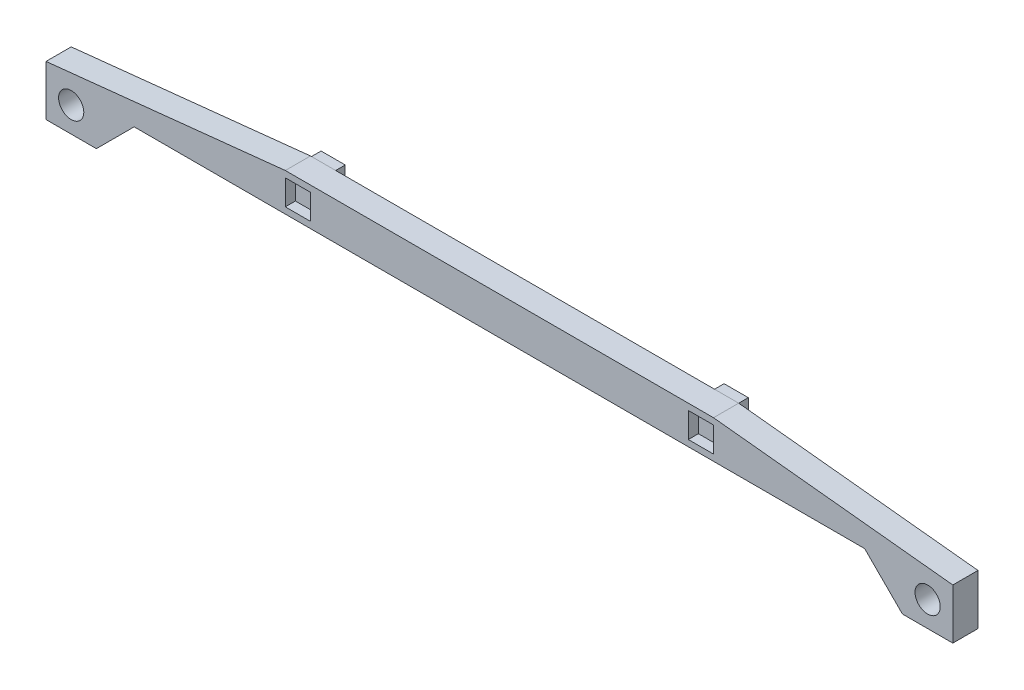
ISO-10303-21;
HEADER;
FILE_DESCRIPTION(('STEP AP214'),'2;1');
FILE_NAME('part.step','',(''),(''),'','','');
FILE_SCHEMA(('AUTOMOTIVE_DESIGN { 1 0 10303 214 1 1 1 1 }'));
ENDSEC;
DATA;
#1=APPLICATION_CONTEXT('core data for automotive mechanical design processes');
#2=APPLICATION_PROTOCOL_DEFINITION('international standard','automotive_design',2000,#1);
#3=PRODUCT_CONTEXT('',#1,'mechanical');
#4=PRODUCT('Part','Part','',(#3));
#5=PRODUCT_RELATED_PRODUCT_CATEGORY('part','',(#4));
#6=PRODUCT_DEFINITION_FORMATION('','',#4);
#7=PRODUCT_DEFINITION_CONTEXT('part definition',#1,'design');
#8=PRODUCT_DEFINITION('design','',#6,#7);
#9=PRODUCT_DEFINITION_SHAPE('','',#8);
#10=(LENGTH_UNIT() NAMED_UNIT(*) SI_UNIT(.MILLI.,.METRE.));
#11=(NAMED_UNIT(*) PLANE_ANGLE_UNIT() SI_UNIT($,.RADIAN.));
#12=(NAMED_UNIT(*) SI_UNIT($,.STERADIAN.) SOLID_ANGLE_UNIT());
#13=UNCERTAINTY_MEASURE_WITH_UNIT(LENGTH_MEASURE(1.E-05),#10,'distance_accuracy_value','');
#14=(GEOMETRIC_REPRESENTATION_CONTEXT(3) GLOBAL_UNCERTAINTY_ASSIGNED_CONTEXT((#13)) GLOBAL_UNIT_ASSIGNED_CONTEXT((#10,
#11,#12)) REPRESENTATION_CONTEXT('',''));
#15=CARTESIAN_POINT('',(0.,0.,0.));
#16=DIRECTION('',(0.,0.,1.));
#17=DIRECTION('',(1.,0.,0.));
#18=AXIS2_PLACEMENT_3D('',#15,#16,#17);
#19=CARTESIAN_POINT('',(-90.0000000000001,-5.,2.5));
#20=DIRECTION('',(0.,1.,0.));
#21=DIRECTION('',(0.,0.,1.));
#22=AXIS2_PLACEMENT_3D('',#19,#20,#21);
#23=PLANE('',#22);
#24=DIRECTION('',(1.,0.,0.));
#25=VECTOR('',#24,1.);
#26=CARTESIAN_POINT('',(-90.0000000000001,-5.,-2.5));
#27=LINE('',#26,#25);
#28=CARTESIAN_POINT('',(-90.0000000000001,-5.,-2.5));
#29=VERTEX_POINT('',#28);
#30=CARTESIAN_POINT('',(-80.,-5.,-2.5));
#31=VERTEX_POINT('',#30);
#32=EDGE_CURVE('E431',#29,#31,#27,.T.);
#33=ORIENTED_EDGE('',*,*,#32,.T.);
#34=DIRECTION('',(0.,0.,1.));
#35=VECTOR('',#34,1.);
#36=CARTESIAN_POINT('',(-80.,-5.,2.5));
#37=LINE('',#36,#35);
#38=CARTESIAN_POINT('',(-80.,-5.,2.5));
#39=VERTEX_POINT('',#38);
#40=EDGE_CURVE('E79',#31,#39,#37,.T.);
#41=ORIENTED_EDGE('',*,*,#40,.T.);
#42=DIRECTION('',(1.,0.,0.));
#43=VECTOR('',#42,1.);
#44=CARTESIAN_POINT('',(-90.0000000000001,-5.,2.5));
#45=LINE('',#44,#43);
#46=CARTESIAN_POINT('',(-90.0000000000001,-5.,2.5));
#47=VERTEX_POINT('',#46);
#48=EDGE_CURVE('E434',#47,#39,#45,.T.);
#49=ORIENTED_EDGE('',*,*,#48,.F.);
#50=DIRECTION('',(0.,0.,-1.));
#51=VECTOR('',#50,1.);
#52=CARTESIAN_POINT('',(-90.0000000000001,-5.,2.5));
#53=LINE('',#52,#51);
#54=EDGE_CURVE('E446',#47,#29,#53,.T.);
#55=ORIENTED_EDGE('',*,*,#54,.T.);
#56=EDGE_LOOP('',(#33,#41,#49,#55));
#57=FACE_BOUND('',#56,.T.);
#58=ADVANCED_FACE('F71',(#57),#23,.F.);
#59=CARTESIAN_POINT('',(-42.5,10.,-4.5));
#60=DIRECTION('',(0.,-1.,0.));
#61=DIRECTION('',(0.,0.,-1.));
#62=AXIS2_PLACEMENT_3D('',#59,#60,#61);
#63=PLANE('',#62);
#64=DIRECTION('',(-1.,0.,0.));
#65=VECTOR('',#64,1.);
#66=CARTESIAN_POINT('',(0.,10.,-2.5));
#67=LINE('',#66,#65);
#68=CARTESIAN_POINT('',(42.5,10.,-2.5));
#69=VERTEX_POINT('',#68);
#70=CARTESIAN_POINT('',(-42.5,10.,-2.5));
#71=VERTEX_POINT('',#70);
#72=EDGE_CURVE('E352',#69,#71,#67,.T.);
#73=ORIENTED_EDGE('',*,*,#72,.T.);
#74=DIRECTION('',(0.,0.,1.));
#75=VECTOR('',#74,1.);
#76=CARTESIAN_POINT('',(-42.5,10.,-4.5));
#77=LINE('',#76,#75);
#78=CARTESIAN_POINT('',(-42.5,10.,2.5));
#79=VERTEX_POINT('',#78);
#80=EDGE_CURVE('E376',#71,#79,#77,.T.);
#81=ORIENTED_EDGE('',*,*,#80,.T.);
#82=DIRECTION('',(1.,0.,0.));
#83=VECTOR('',#82,1.);
#84=CARTESIAN_POINT('',(0.,10.,2.5));
#85=LINE('',#84,#83);
#86=CARTESIAN_POINT('',(42.5,10.,2.5));
#87=VERTEX_POINT('',#86);
#88=EDGE_CURVE('E410',#79,#87,#85,.T.);
#89=ORIENTED_EDGE('',*,*,#88,.T.);
#90=DIRECTION('',(0.,0.,1.));
#91=VECTOR('',#90,1.);
#92=CARTESIAN_POINT('',(42.5,10.,-4.5));
#93=LINE('',#92,#91);
#94=EDGE_CURVE('E412',#69,#87,#93,.T.);
#95=ORIENTED_EDGE('',*,*,#94,.F.);
#96=EDGE_LOOP('',(#73,#81,#89,#95));
#97=FACE_BOUND('',#96,.T.);
#98=ADVANCED_FACE('F501',(#97),#63,.F.);
#99=CARTESIAN_POINT('',(0.,0.,2.5));
#100=DIRECTION('',(0.,0.,-1.));
#101=DIRECTION('',(-1.,0.,0.));
#102=AXIS2_PLACEMENT_3D('',#99,#100,#101);
#103=PLANE('',#102);
#104=DIRECTION('',(-1.,0.,0.));
#105=VECTOR('',#104,1.);
#106=CARTESIAN_POINT('',(-42.5,8.75000000000001,2.5));
#107=LINE('',#106,#105);
#108=CARTESIAN_POINT('',(-37.5,8.75000000000001,2.5));
#109=VERTEX_POINT('',#108);
#110=CARTESIAN_POINT('',(-42.5,8.75000000000001,2.5));
#111=VERTEX_POINT('',#110);
#112=EDGE_CURVE('E272',#109,#111,#107,.T.);
#113=ORIENTED_EDGE('',*,*,#112,.F.);
#114=DIRECTION('',(0.,1.,0.));
#115=VECTOR('',#114,1.);
#116=CARTESIAN_POINT('',(-37.5,3.75000000000001,2.5));
#117=LINE('',#116,#115);
#118=CARTESIAN_POINT('',(-37.5,3.75000000000001,2.5));
#119=VERTEX_POINT('',#118);
#120=EDGE_CURVE('E86',#119,#109,#117,.T.);
#121=ORIENTED_EDGE('',*,*,#120,.F.);
#122=DIRECTION('',(1.,0.,0.));
#123=VECTOR('',#122,1.);
#124=CARTESIAN_POINT('',(-42.5,3.75000000000001,2.5));
#125=LINE('',#124,#123);
#126=CARTESIAN_POINT('',(-42.5,3.75000000000001,2.5));
#127=VERTEX_POINT('',#126);
#128=EDGE_CURVE('E263',#127,#119,#125,.T.);
#129=ORIENTED_EDGE('',*,*,#128,.F.);
#130=DIRECTION('',(0.,-1.,0.));
#131=VECTOR('',#130,1.);
#132=CARTESIAN_POINT('',(-42.5,3.75000000000001,2.5));
#133=LINE('',#132,#131);
#134=EDGE_CURVE('E266',#111,#127,#133,.T.);
#135=ORIENTED_EDGE('',*,*,#134,.F.);
#136=EDGE_LOOP('',(#113,#121,#129,#135));
#137=FACE_BOUND('',#136,.T.);
#138=DIRECTION('',(-1.,0.,0.));
#139=VECTOR('',#138,1.);
#140=CARTESIAN_POINT('',(37.5,8.75000000000001,2.5));
#141=LINE('',#140,#139);
#142=CARTESIAN_POINT('',(42.5,8.75000000000001,2.5));
#143=VERTEX_POINT('',#142);
#144=CARTESIAN_POINT('',(37.5,8.75000000000001,2.5));
#145=VERTEX_POINT('',#144);
#146=EDGE_CURVE('E298',#143,#145,#141,.T.);
#147=ORIENTED_EDGE('',*,*,#146,.F.);
#148=DIRECTION('',(0.,1.,0.));
#149=VECTOR('',#148,1.);
#150=CARTESIAN_POINT('',(42.5,3.75000000000001,2.5));
#151=LINE('',#150,#149);
#152=CARTESIAN_POINT('',(42.5,3.75000000000001,2.5));
#153=VERTEX_POINT('',#152);
#154=EDGE_CURVE('E94',#153,#143,#151,.T.);
#155=ORIENTED_EDGE('',*,*,#154,.F.);
#156=DIRECTION('',(1.,0.,0.));
#157=VECTOR('',#156,1.);
#158=CARTESIAN_POINT('',(37.5,3.75000000000001,2.5));
#159=LINE('',#158,#157);
#160=CARTESIAN_POINT('',(37.5,3.75000000000001,2.5));
#161=VERTEX_POINT('',#160);
#162=EDGE_CURVE('E291',#161,#153,#159,.T.);
#163=ORIENTED_EDGE('',*,*,#162,.F.);
#164=DIRECTION('',(0.,-1.,0.));
#165=VECTOR('',#164,1.);
#166=CARTESIAN_POINT('',(37.5,3.75000000000001,2.5));
#167=LINE('',#166,#165);
#168=EDGE_CURVE('E294',#145,#161,#167,.T.);
#169=ORIENTED_EDGE('',*,*,#168,.F.);
#170=EDGE_LOOP('',(#147,#155,#163,#169));
#171=FACE_BOUND('',#170,.T.);
#172=ORIENTED_EDGE('',*,*,#88,.F.);
#173=DIRECTION('',(-0.994505452921406,-0.104684784518043,0.));
#174=VECTOR('',#173,1.);
#175=CARTESIAN_POINT('',(-42.5,10.,2.5));
#176=LINE('',#175,#174);
#177=CARTESIAN_POINT('',(-90.0000000000001,5.,2.5));
#178=VERTEX_POINT('',#177);
#179=EDGE_CURVE('E317',#79,#178,#176,.T.);
#180=ORIENTED_EDGE('',*,*,#179,.T.);
#181=DIRECTION('',(0.,-1.,0.));
#182=VECTOR('',#181,1.);
#183=CARTESIAN_POINT('',(-90.0000000000001,-5.,2.5));
#184=LINE('',#183,#182);
#185=EDGE_CURVE('E430',#178,#47,#184,.T.);
#186=ORIENTED_EDGE('',*,*,#185,.T.);
#187=ORIENTED_EDGE('',*,*,#48,.T.);
#188=DIRECTION('',(-0.707106781186545,-0.70710678118655,0.));
#189=VECTOR('',#188,1.);
#190=CARTESIAN_POINT('',(-80.,-5.,2.5));
#191=LINE('',#190,#189);
#192=CARTESIAN_POINT('',(-72.5000000000001,2.5,2.5));
#193=VERTEX_POINT('',#192);
#194=EDGE_CURVE('E328',#193,#39,#191,.T.);
#195=ORIENTED_EDGE('',*,*,#194,.F.);
#196=DIRECTION('',(-1.,0.,0.));
#197=VECTOR('',#196,1.);
#198=CARTESIAN_POINT('',(-72.5000000000001,2.5,2.5));
#199=LINE('',#198,#197);
#200=CARTESIAN_POINT('',(72.5000000000001,2.5,2.5));
#201=VERTEX_POINT('',#200);
#202=EDGE_CURVE('E325',#201,#193,#199,.T.);
#203=ORIENTED_EDGE('',*,*,#202,.F.);
#204=DIRECTION('',(-0.707106781186545,0.70710678118655,0.));
#205=VECTOR('',#204,1.);
#206=CARTESIAN_POINT('',(72.5000000000001,2.5,2.5));
#207=LINE('',#206,#205);
#208=CARTESIAN_POINT('',(80.,-5.,2.5));
#209=VERTEX_POINT('',#208);
#210=EDGE_CURVE('E322',#209,#201,#207,.T.);
#211=ORIENTED_EDGE('',*,*,#210,.F.);
#212=CARTESIAN_POINT('',(89.9999999999999,-5.,2.5));
#213=VERTEX_POINT('',#212);
#214=EDGE_CURVE('E433',#209,#213,#45,.T.);
#215=ORIENTED_EDGE('',*,*,#214,.T.);
#216=DIRECTION('',(0.,1.,0.));
#217=VECTOR('',#216,1.);
#218=CARTESIAN_POINT('',(89.9999999999999,-5.,2.5));
#219=LINE('',#218,#217);
#220=CARTESIAN_POINT('',(89.9999999999999,5.,2.5));
#221=VERTEX_POINT('',#220);
#222=EDGE_CURVE('E428',#213,#221,#219,.T.);
#223=ORIENTED_EDGE('',*,*,#222,.T.);
#224=DIRECTION('',(-0.994505452921406,0.104684784518043,0.));
#225=VECTOR('',#224,1.);
#226=CARTESIAN_POINT('',(89.9999999999999,5.,2.5));
#227=LINE('',#226,#225);
#228=EDGE_CURVE('E314',#221,#87,#227,.T.);
#229=ORIENTED_EDGE('',*,*,#228,.T.);
#230=EDGE_LOOP('',(#172,#180,#186,#187,#195,#203,#211,#215,#223,#229));
#231=FACE_BOUND('',#230,.T.);
#232=CARTESIAN_POINT('',(-85.,0.,2.5));
#233=DIRECTION('',(0.,0.,1.));
#234=DIRECTION('',(1.,0.,0.));
#235=AXIS2_PLACEMENT_3D('',#232,#233,#234);
#236=CIRCLE('',#235,2.49999999999999);
#237=CARTESIAN_POINT('',(-82.5,0.,2.5));
#238=VERTEX_POINT('',#237);
#239=EDGE_CURVE('E422',#238,#238,#236,.T.);
#240=ORIENTED_EDGE('',*,*,#239,.F.);
#241=EDGE_LOOP('',(#240));
#242=FACE_BOUND('',#241,.T.);
#243=CARTESIAN_POINT('',(85.,0.,2.5));
#244=DIRECTION('',(0.,0.,1.));
#245=DIRECTION('',(1.,0.,0.));
#246=AXIS2_PLACEMENT_3D('',#243,#244,#245);
#247=CIRCLE('',#246,2.49999999999999);
#248=CARTESIAN_POINT('',(87.5,0.,2.5));
#249=VERTEX_POINT('',#248);
#250=EDGE_CURVE('E416',#249,#249,#247,.T.);
#251=ORIENTED_EDGE('',*,*,#250,.F.);
#252=EDGE_LOOP('',(#251));
#253=FACE_BOUND('',#252,.T.);
#254=ADVANCED_FACE('F465',(#137,#171,#231,#242,#253),#103,.F.);
#255=CARTESIAN_POINT('',(0.,0.,-2.5));
#256=DIRECTION('',(0.,0.,-1.));
#257=DIRECTION('',(-1.,0.,0.));
#258=AXIS2_PLACEMENT_3D('',#255,#256,#257);
#259=PLANE('',#258);
#260=DIRECTION('',(0.,-1.,0.));
#261=VECTOR('',#260,1.);
#262=CARTESIAN_POINT('',(-90.0000000000001,-5.,-2.5));
#263=LINE('',#262,#261);
#264=CARTESIAN_POINT('',(-90.0000000000001,5.,-2.5));
#265=VERTEX_POINT('',#264);
#266=EDGE_CURVE('E439',#265,#29,#263,.T.);
#267=ORIENTED_EDGE('',*,*,#266,.F.);
#268=DIRECTION('',(-0.994505452921406,-0.104684784518043,0.));
#269=VECTOR('',#268,1.);
#270=CARTESIAN_POINT('',(-42.5,10.,-2.5));
#271=LINE('',#270,#269);
#272=EDGE_CURVE('E320',#71,#265,#271,.T.);
#273=ORIENTED_EDGE('',*,*,#272,.F.);
#274=ORIENTED_EDGE('',*,*,#72,.F.);
#275=DIRECTION('',(-0.994505452921406,0.104684784518043,0.));
#276=VECTOR('',#275,1.);
#277=CARTESIAN_POINT('',(89.9999999999999,5.,-2.5));
#278=LINE('',#277,#276);
#279=CARTESIAN_POINT('',(89.9999999999999,5.,-2.5));
#280=VERTEX_POINT('',#279);
#281=EDGE_CURVE('E278',#280,#69,#278,.T.);
#282=ORIENTED_EDGE('',*,*,#281,.F.);
#283=DIRECTION('',(0.,1.,0.));
#284=VECTOR('',#283,1.);
#285=CARTESIAN_POINT('',(89.9999999999999,-5.,-2.5));
#286=LINE('',#285,#284);
#287=CARTESIAN_POINT('',(89.9999999999999,-5.,-2.5));
#288=VERTEX_POINT('',#287);
#289=EDGE_CURVE('E425',#288,#280,#286,.T.);
#290=ORIENTED_EDGE('',*,*,#289,.F.);
#291=CARTESIAN_POINT('',(80.,-5.,-2.5));
#292=VERTEX_POINT('',#291);
#293=EDGE_CURVE('E441',#292,#288,#27,.T.);
#294=ORIENTED_EDGE('',*,*,#293,.F.);
#295=DIRECTION('',(0.707106781186545,-0.70710678118655,0.));
#296=VECTOR('',#295,1.);
#297=CARTESIAN_POINT('',(37.5000000000003,37.5,-2.5));
#298=LINE('',#297,#296);
#299=CARTESIAN_POINT('',(72.5000000000001,2.5,-2.5));
#300=VERTEX_POINT('',#299);
#301=EDGE_CURVE('E333',#300,#292,#298,.T.);
#302=ORIENTED_EDGE('',*,*,#301,.F.);
#303=DIRECTION('',(1.,0.,0.));
#304=VECTOR('',#303,1.);
#305=CARTESIAN_POINT('',(0.,2.5,-2.5));
#306=LINE('',#305,#304);
#307=CARTESIAN_POINT('',(-72.5000000000001,2.5,-2.5));
#308=VERTEX_POINT('',#307);
#309=EDGE_CURVE('E12',#308,#300,#306,.T.);
#310=ORIENTED_EDGE('',*,*,#309,.F.);
#311=DIRECTION('',(0.707106781186545,0.70710678118655,0.));
#312=VECTOR('',#311,1.);
#313=CARTESIAN_POINT('',(-37.5000000000003,37.5,-2.5));
#314=LINE('',#313,#312);
#315=EDGE_CURVE('E336',#31,#308,#314,.T.);
#316=ORIENTED_EDGE('',*,*,#315,.F.);
#317=ORIENTED_EDGE('',*,*,#32,.F.);
#318=EDGE_LOOP('',(#267,#273,#274,#282,#290,#294,#302,#310,#316,#317));
#319=FACE_BOUND('',#318,.T.);
#320=CARTESIAN_POINT('',(-85.,0.,-2.5));
#321=DIRECTION('',(0.,0.,1.));
#322=DIRECTION('',(1.,0.,0.));
#323=AXIS2_PLACEMENT_3D('',#320,#321,#322);
#324=CIRCLE('',#323,2.49999999999999);
#325=CARTESIAN_POINT('',(-82.5,0.,-2.5));
#326=VERTEX_POINT('',#325);
#327=EDGE_CURVE('E419',#326,#326,#324,.T.);
#328=ORIENTED_EDGE('',*,*,#327,.T.);
#329=EDGE_LOOP('',(#328));
#330=FACE_BOUND('',#329,.T.);
#331=CARTESIAN_POINT('',(85.,0.,-2.5));
#332=DIRECTION('',(0.,0.,1.));
#333=DIRECTION('',(1.,0.,0.));
#334=AXIS2_PLACEMENT_3D('',#331,#332,#333);
#335=CIRCLE('',#334,2.49999999999999);
#336=CARTESIAN_POINT('',(87.5,0.,-2.5));
#337=VERTEX_POINT('',#336);
#338=EDGE_CURVE('E415',#337,#337,#335,.T.);
#339=ORIENTED_EDGE('',*,*,#338,.T.);
#340=EDGE_LOOP('',(#339));
#341=FACE_BOUND('',#340,.T.);
#342=DIRECTION('',(-1.,0.,0.));
#343=VECTOR('',#342,1.);
#344=CARTESIAN_POINT('',(0.,9.9,-2.5));
#345=LINE('',#344,#343);
#346=CARTESIAN_POINT('',(-37.6,9.9,-2.5));
#347=VERTEX_POINT('',#346);
#348=CARTESIAN_POINT('',(-42.4,9.9,-2.5));
#349=VERTEX_POINT('',#348);
#350=EDGE_CURVE('E357',#347,#349,#345,.T.);
#351=ORIENTED_EDGE('',*,*,#350,.T.);
#352=DIRECTION('',(0.,-1.,0.));
#353=VECTOR('',#352,1.);
#354=CARTESIAN_POINT('',(-42.4,0.,-2.5));
#355=LINE('',#354,#353);
#356=CARTESIAN_POINT('',(-42.4,5.1,-2.5));
#357=VERTEX_POINT('',#356);
#358=EDGE_CURVE('E364',#349,#357,#355,.T.);
#359=ORIENTED_EDGE('',*,*,#358,.T.);
#360=DIRECTION('',(1.,0.,0.));
#361=VECTOR('',#360,1.);
#362=CARTESIAN_POINT('',(0.,5.1,-2.5));
#363=LINE('',#362,#361);
#364=CARTESIAN_POINT('',(-37.6,5.1,-2.5));
#365=VERTEX_POINT('',#364);
#366=EDGE_CURVE('E347',#357,#365,#363,.T.);
#367=ORIENTED_EDGE('',*,*,#366,.T.);
#368=DIRECTION('',(0.,1.,0.));
#369=VECTOR('',#368,1.);
#370=CARTESIAN_POINT('',(-37.6,0.,-2.5));
#371=LINE('',#370,#369);
#372=EDGE_CURVE('E342',#365,#347,#371,.T.);
#373=ORIENTED_EDGE('',*,*,#372,.T.);
#374=EDGE_LOOP('',(#351,#359,#367,#373));
#375=FACE_BOUND('',#374,.T.);
#376=DIRECTION('',(1.,0.,0.));
#377=VECTOR('',#376,1.);
#378=CARTESIAN_POINT('',(0.,5.1,-2.5));
#379=LINE('',#378,#377);
#380=CARTESIAN_POINT('',(37.6,5.1,-2.5));
#381=VERTEX_POINT('',#380);
#382=CARTESIAN_POINT('',(42.4,5.1,-2.5));
#383=VERTEX_POINT('',#382);
#384=EDGE_CURVE('E393',#381,#383,#379,.T.);
#385=ORIENTED_EDGE('',*,*,#384,.T.);
#386=DIRECTION('',(0.,1.,0.));
#387=VECTOR('',#386,1.);
#388=CARTESIAN_POINT('',(42.4,0.,-2.5));
#389=LINE('',#388,#387);
#390=CARTESIAN_POINT('',(42.4,9.89999999999998,-2.5));
#391=VERTEX_POINT('',#390);
#392=EDGE_CURVE('E338',#383,#391,#389,.T.);
#393=ORIENTED_EDGE('',*,*,#392,.T.);
#394=DIRECTION('',(-1.,0.,0.));
#395=VECTOR('',#394,1.);
#396=CARTESIAN_POINT('',(0.,9.89999999999998,-2.5));
#397=LINE('',#396,#395);
#398=CARTESIAN_POINT('',(37.6,9.89999999999998,-2.5));
#399=VERTEX_POINT('',#398);
#400=EDGE_CURVE('E385',#391,#399,#397,.T.);
#401=ORIENTED_EDGE('',*,*,#400,.T.);
#402=DIRECTION('',(0.,-1.,0.));
#403=VECTOR('',#402,1.);
#404=CARTESIAN_POINT('',(37.6,0.,-2.5));
#405=LINE('',#404,#403);
#406=EDGE_CURVE('E380',#399,#381,#405,.T.);
#407=ORIENTED_EDGE('',*,*,#406,.T.);
#408=EDGE_LOOP('',(#385,#393,#401,#407));
#409=FACE_BOUND('',#408,.T.);
#410=ADVANCED_FACE('F475',(#319,#330,#341,#375,#409),#259,.T.);
#411=CARTESIAN_POINT('',(89.9999999999999,-5.,2.5));
#412=DIRECTION('',(-1.,0.,0.));
#413=DIRECTION('',(0.,0.,1.));
#414=AXIS2_PLACEMENT_3D('',#411,#412,#413);
#415=PLANE('',#414);
#416=ORIENTED_EDGE('',*,*,#289,.T.);
#417=DIRECTION('',(0.,0.,-1.));
#418=VECTOR('',#417,1.);
#419=CARTESIAN_POINT('',(89.9999999999999,5.,2.5));
#420=LINE('',#419,#418);
#421=EDGE_CURVE('E452',#221,#280,#420,.T.);
#422=ORIENTED_EDGE('',*,*,#421,.F.);
#423=ORIENTED_EDGE('',*,*,#222,.F.);
#424=DIRECTION('',(0.,0.,-1.));
#425=VECTOR('',#424,1.);
#426=CARTESIAN_POINT('',(89.9999999999999,-5.,2.5));
#427=LINE('',#426,#425);
#428=EDGE_CURVE('E437',#213,#288,#427,.T.);
#429=ORIENTED_EDGE('',*,*,#428,.T.);
#430=EDGE_LOOP('',(#416,#422,#423,#429));
#431=FACE_BOUND('',#430,.T.);
#432=ADVANCED_FACE('F73',(#431),#415,.F.);
#433=CARTESIAN_POINT('',(-90.0000000000001,-5.,2.5));
#434=DIRECTION('',(1.,0.,0.));
#435=DIRECTION('',(0.,0.,-1.));
#436=AXIS2_PLACEMENT_3D('',#433,#434,#435);
#437=PLANE('',#436);
#438=ORIENTED_EDGE('',*,*,#266,.T.);
#439=ORIENTED_EDGE('',*,*,#54,.F.);
#440=ORIENTED_EDGE('',*,*,#185,.F.);
#441=DIRECTION('',(0.,0.,-1.));
#442=VECTOR('',#441,1.);
#443=CARTESIAN_POINT('',(-90.0000000000001,5.,2.5));
#444=LINE('',#443,#442);
#445=EDGE_CURVE('E449',#178,#265,#444,.T.);
#446=ORIENTED_EDGE('',*,*,#445,.T.);
#447=EDGE_LOOP('',(#438,#439,#440,#446));
#448=FACE_BOUND('',#447,.T.);
#449=ADVANCED_FACE('F472',(#448),#437,.F.);
#450=ORIENTED_EDGE('',*,*,#214,.F.);
#451=DIRECTION('',(0.,0.,-1.));
#452=VECTOR('',#451,1.);
#453=CARTESIAN_POINT('',(80.,-5.,2.5));
#454=LINE('',#453,#452);
#455=EDGE_CURVE('E455',#209,#292,#454,.T.);
#456=ORIENTED_EDGE('',*,*,#455,.T.);
#457=ORIENTED_EDGE('',*,*,#293,.T.);
#458=ORIENTED_EDGE('',*,*,#428,.F.);
#459=EDGE_LOOP('',(#450,#456,#457,#458));
#460=FACE_BOUND('',#459,.T.);
#461=ADVANCED_FACE('F489',(#460),#23,.F.);
#462=CARTESIAN_POINT('',(-85.,0.,2.5));
#463=DIRECTION('',(0.,0.,-1.));
#464=DIRECTION('',(-1.,0.,0.));
#465=AXIS2_PLACEMENT_3D('',#462,#463,#464);
#466=CYLINDRICAL_SURFACE('',#465,2.49999999999999);
#467=ORIENTED_EDGE('',*,*,#239,.T.);
#468=EDGE_LOOP('',(#467));
#469=FACE_BOUND('',#468,.T.);
#470=ORIENTED_EDGE('',*,*,#327,.F.);
#471=EDGE_LOOP('',(#470));
#472=FACE_BOUND('',#471,.T.);
#473=ADVANCED_FACE('F525',(#469,#472),#466,.F.);
#474=CARTESIAN_POINT('',(85.,0.,2.5));
#475=DIRECTION('',(0.,0.,-1.));
#476=DIRECTION('',(-1.,0.,0.));
#477=AXIS2_PLACEMENT_3D('',#474,#475,#476);
#478=CYLINDRICAL_SURFACE('',#477,2.49999999999999);
#479=ORIENTED_EDGE('',*,*,#250,.T.);
#480=EDGE_LOOP('',(#479));
#481=FACE_BOUND('',#480,.T.);
#482=ORIENTED_EDGE('',*,*,#338,.F.);
#483=EDGE_LOOP('',(#482));
#484=FACE_BOUND('',#483,.T.);
#485=ADVANCED_FACE('F530',(#481,#484),#478,.F.);
#486=CARTESIAN_POINT('',(-42.4,0.,4.57106781186548));
#487=DIRECTION('',(-1.,0.,0.));
#488=DIRECTION('',(0.,0.,1.));
#489=AXIS2_PLACEMENT_3D('',#486,#487,#488);
#490=PLANE('',#489);
#491=DIRECTION('',(0.,0.,-1.));
#492=VECTOR('',#491,1.);
#493=CARTESIAN_POINT('',(-42.4,9.9,4.57106781186548));
#494=LINE('',#493,#492);
#495=CARTESIAN_POINT('',(-42.4,9.9,-4.5));
#496=VERTEX_POINT('',#495);
#497=EDGE_CURVE('E343',#349,#496,#494,.T.);
#498=ORIENTED_EDGE('',*,*,#497,.T.);
#499=DIRECTION('',(0.,1.,0.));
#500=VECTOR('',#499,1.);
#501=CARTESIAN_POINT('',(-42.4,0.,-4.5));
#502=LINE('',#501,#500);
#503=CARTESIAN_POINT('',(-42.4,5.1,-4.5));
#504=VERTEX_POINT('',#503);
#505=EDGE_CURVE('E354',#504,#496,#502,.T.);
#506=ORIENTED_EDGE('',*,*,#505,.F.);
#507=DIRECTION('',(0.,0.,-1.));
#508=VECTOR('',#507,1.);
#509=CARTESIAN_POINT('',(-42.4,5.1,4.57106781186548));
#510=LINE('',#509,#508);
#511=EDGE_CURVE('E358',#357,#504,#510,.T.);
#512=ORIENTED_EDGE('',*,*,#511,.F.);
#513=ORIENTED_EDGE('',*,*,#358,.F.);
#514=EDGE_LOOP('',(#498,#506,#512,#513));
#515=FACE_BOUND('',#514,.T.);
#516=ADVANCED_FACE('F547',(#515),#490,.T.);
#517=CARTESIAN_POINT('',(0.,9.9,4.57106781186548));
#518=DIRECTION('',(0.,1.,0.));
#519=DIRECTION('',(0.,0.,1.));
#520=AXIS2_PLACEMENT_3D('',#517,#518,#519);
#521=PLANE('',#520);
#522=DIRECTION('',(0.,0.,-1.));
#523=VECTOR('',#522,1.);
#524=CARTESIAN_POINT('',(-37.6,9.9,4.57106781186548));
#525=LINE('',#524,#523);
#526=CARTESIAN_POINT('',(-37.6,9.9,-4.5));
#527=VERTEX_POINT('',#526);
#528=EDGE_CURVE('E348',#347,#527,#525,.T.);
#529=ORIENTED_EDGE('',*,*,#528,.T.);
#530=DIRECTION('',(1.,0.,0.));
#531=VECTOR('',#530,1.);
#532=CARTESIAN_POINT('',(0.,9.9,-4.5));
#533=LINE('',#532,#531);
#534=EDGE_CURVE('E339',#496,#527,#533,.T.);
#535=ORIENTED_EDGE('',*,*,#534,.F.);
#536=ORIENTED_EDGE('',*,*,#497,.F.);
#537=ORIENTED_EDGE('',*,*,#350,.F.);
#538=EDGE_LOOP('',(#529,#535,#536,#537));
#539=FACE_BOUND('',#538,.T.);
#540=ADVANCED_FACE('F575',(#539),#521,.T.);
#541=CARTESIAN_POINT('',(-37.6,0.,4.57106781186548));
#542=DIRECTION('',(1.,0.,0.));
#543=DIRECTION('',(0.,0.,-1.));
#544=AXIS2_PLACEMENT_3D('',#541,#542,#543);
#545=PLANE('',#544);
#546=DIRECTION('',(0.,0.,-1.));
#547=VECTOR('',#546,1.);
#548=CARTESIAN_POINT('',(-37.6,5.1,4.57106781186548));
#549=LINE('',#548,#547);
#550=CARTESIAN_POINT('',(-37.6,5.1,-4.5));
#551=VERTEX_POINT('',#550);
#552=EDGE_CURVE('E353',#365,#551,#549,.T.);
#553=ORIENTED_EDGE('',*,*,#552,.T.);
#554=DIRECTION('',(0.,-1.,0.));
#555=VECTOR('',#554,1.);
#556=CARTESIAN_POINT('',(-37.6,0.,-4.5));
#557=LINE('',#556,#555);
#558=EDGE_CURVE('E344',#527,#551,#557,.T.);
#559=ORIENTED_EDGE('',*,*,#558,.F.);
#560=ORIENTED_EDGE('',*,*,#528,.F.);
#561=ORIENTED_EDGE('',*,*,#372,.F.);
#562=EDGE_LOOP('',(#553,#559,#560,#561));
#563=FACE_BOUND('',#562,.T.);
#564=ADVANCED_FACE('F579',(#563),#545,.T.);
#565=CARTESIAN_POINT('',(0.,5.1,4.57106781186548));
#566=DIRECTION('',(0.,-1.,0.));
#567=DIRECTION('',(0.,0.,-1.));
#568=AXIS2_PLACEMENT_3D('',#565,#566,#567);
#569=PLANE('',#568);
#570=ORIENTED_EDGE('',*,*,#511,.T.);
#571=DIRECTION('',(-1.,0.,0.));
#572=VECTOR('',#571,1.);
#573=CARTESIAN_POINT('',(0.,5.1,-4.5));
#574=LINE('',#573,#572);
#575=EDGE_CURVE('E349',#551,#504,#574,.T.);
#576=ORIENTED_EDGE('',*,*,#575,.F.);
#577=ORIENTED_EDGE('',*,*,#552,.F.);
#578=ORIENTED_EDGE('',*,*,#366,.F.);
#579=EDGE_LOOP('',(#570,#576,#577,#578));
#580=FACE_BOUND('',#579,.T.);
#581=ADVANCED_FACE('F561',(#580),#569,.T.);
#582=CARTESIAN_POINT('',(42.4,0.,4.57106781186548));
#583=DIRECTION('',(1.,0.,0.));
#584=DIRECTION('',(0.,0.,-1.));
#585=AXIS2_PLACEMENT_3D('',#582,#583,#584);
#586=PLANE('',#585);
#587=DIRECTION('',(0.,0.,-1.));
#588=VECTOR('',#587,1.);
#589=CARTESIAN_POINT('',(42.4,5.1,4.57106781186548));
#590=LINE('',#589,#588);
#591=CARTESIAN_POINT('',(42.4,5.1,-4.5));
#592=VERTEX_POINT('',#591);
#593=EDGE_CURVE('E381',#383,#592,#590,.T.);
#594=ORIENTED_EDGE('',*,*,#593,.T.);
#595=DIRECTION('',(0.,-1.,0.));
#596=VECTOR('',#595,1.);
#597=CARTESIAN_POINT('',(42.4,0.,-4.5));
#598=LINE('',#597,#596);
#599=CARTESIAN_POINT('',(42.4,9.89999999999998,-4.5));
#600=VERTEX_POINT('',#599);
#601=EDGE_CURVE('E390',#600,#592,#598,.T.);
#602=ORIENTED_EDGE('',*,*,#601,.F.);
#603=DIRECTION('',(0.,0.,-1.));
#604=VECTOR('',#603,1.);
#605=CARTESIAN_POINT('',(42.4,9.89999999999998,4.57106781186548));
#606=LINE('',#605,#604);
#607=EDGE_CURVE('E394',#391,#600,#606,.T.);
#608=ORIENTED_EDGE('',*,*,#607,.F.);
#609=ORIENTED_EDGE('',*,*,#392,.F.);
#610=EDGE_LOOP('',(#594,#602,#608,#609));
#611=FACE_BOUND('',#610,.T.);
#612=ADVANCED_FACE('F557',(#611),#586,.T.);
#613=CARTESIAN_POINT('',(0.,5.1,4.57106781186548));
#614=DIRECTION('',(0.,-1.,0.));
#615=DIRECTION('',(0.,0.,-1.));
#616=AXIS2_PLACEMENT_3D('',#613,#614,#615);
#617=PLANE('',#616);
#618=DIRECTION('',(0.,0.,-1.));
#619=VECTOR('',#618,1.);
#620=CARTESIAN_POINT('',(37.6,5.1,4.57106781186548));
#621=LINE('',#620,#619);
#622=CARTESIAN_POINT('',(37.6,5.1,-4.5));
#623=VERTEX_POINT('',#622);
#624=EDGE_CURVE('E386',#381,#623,#621,.T.);
#625=ORIENTED_EDGE('',*,*,#624,.T.);
#626=DIRECTION('',(-1.,0.,0.));
#627=VECTOR('',#626,1.);
#628=CARTESIAN_POINT('',(0.,5.1,-4.5));
#629=LINE('',#628,#627);
#630=EDGE_CURVE('E377',#592,#623,#629,.T.);
#631=ORIENTED_EDGE('',*,*,#630,.F.);
#632=ORIENTED_EDGE('',*,*,#593,.F.);
#633=ORIENTED_EDGE('',*,*,#384,.F.);
#634=EDGE_LOOP('',(#625,#631,#632,#633));
#635=FACE_BOUND('',#634,.T.);
#636=ADVANCED_FACE('F560',(#635),#617,.T.);
#637=CARTESIAN_POINT('',(37.6,0.,4.57106781186548));
#638=DIRECTION('',(-1.,0.,0.));
#639=DIRECTION('',(0.,0.,1.));
#640=AXIS2_PLACEMENT_3D('',#637,#638,#639);
#641=PLANE('',#640);
#642=DIRECTION('',(0.,0.,-1.));
#643=VECTOR('',#642,1.);
#644=CARTESIAN_POINT('',(37.6,9.89999999999998,4.57106781186548));
#645=LINE('',#644,#643);
#646=CARTESIAN_POINT('',(37.6,9.89999999999998,-4.5));
#647=VERTEX_POINT('',#646);
#648=EDGE_CURVE('E389',#399,#647,#645,.T.);
#649=ORIENTED_EDGE('',*,*,#648,.T.);
#650=DIRECTION('',(0.,1.,0.));
#651=VECTOR('',#650,1.);
#652=CARTESIAN_POINT('',(37.6,0.,-4.5));
#653=LINE('',#652,#651);
#654=EDGE_CURVE('E382',#623,#647,#653,.T.);
#655=ORIENTED_EDGE('',*,*,#654,.F.);
#656=ORIENTED_EDGE('',*,*,#624,.F.);
#657=ORIENTED_EDGE('',*,*,#406,.F.);
#658=EDGE_LOOP('',(#649,#655,#656,#657));
#659=FACE_BOUND('',#658,.T.);
#660=ADVANCED_FACE('F565',(#659),#641,.T.);
#661=CARTESIAN_POINT('',(0.,9.89999999999998,4.57106781186548));
#662=DIRECTION('',(0.,1.,0.));
#663=DIRECTION('',(0.,0.,1.));
#664=AXIS2_PLACEMENT_3D('',#661,#662,#663);
#665=PLANE('',#664);
#666=ORIENTED_EDGE('',*,*,#607,.T.);
#667=DIRECTION('',(1.,0.,0.));
#668=VECTOR('',#667,1.);
#669=CARTESIAN_POINT('',(0.,9.89999999999998,-4.5));
#670=LINE('',#669,#668);
#671=EDGE_CURVE('E367',#647,#600,#670,.T.);
#672=ORIENTED_EDGE('',*,*,#671,.F.);
#673=ORIENTED_EDGE('',*,*,#648,.F.);
#674=ORIENTED_EDGE('',*,*,#400,.F.);
#675=EDGE_LOOP('',(#666,#672,#673,#674));
#676=FACE_BOUND('',#675,.T.);
#677=ADVANCED_FACE('F554',(#676),#665,.T.);
#678=CARTESIAN_POINT('',(0.,0.,-4.5));
#679=DIRECTION('',(0.,0.,1.));
#680=DIRECTION('',(1.,0.,0.));
#681=AXIS2_PLACEMENT_3D('',#678,#679,#680);
#682=PLANE('',#681);
#683=ORIENTED_EDGE('',*,*,#505,.T.);
#684=ORIENTED_EDGE('',*,*,#534,.T.);
#685=ORIENTED_EDGE('',*,*,#558,.T.);
#686=ORIENTED_EDGE('',*,*,#575,.T.);
#687=EDGE_LOOP('',(#683,#684,#685,#686));
#688=FACE_BOUND('',#687,.T.);
#689=ADVANCED_FACE('F551',(#688),#682,.F.);
#690=CARTESIAN_POINT('',(0.,0.,-4.5));
#691=DIRECTION('',(0.,0.,1.));
#692=DIRECTION('',(1.,0.,0.));
#693=AXIS2_PLACEMENT_3D('',#690,#691,#692);
#694=PLANE('',#693);
#695=ORIENTED_EDGE('',*,*,#601,.T.);
#696=ORIENTED_EDGE('',*,*,#630,.T.);
#697=ORIENTED_EDGE('',*,*,#654,.T.);
#698=ORIENTED_EDGE('',*,*,#671,.T.);
#699=EDGE_LOOP('',(#695,#696,#697,#698));
#700=FACE_BOUND('',#699,.T.);
#701=ADVANCED_FACE('F549',(#700),#694,.F.);
#702=CARTESIAN_POINT('',(-80.,-5.,-4.5));
#703=DIRECTION('',(-0.70710678118655,0.707106781186545,0.));
#704=DIRECTION('',(-0.707106781186545,-0.70710678118655,0.));
#705=AXIS2_PLACEMENT_3D('',#702,#703,#704);
#706=PLANE('',#705);
#707=ORIENTED_EDGE('',*,*,#315,.T.);
#708=DIRECTION('',(0.,0.,1.));
#709=VECTOR('',#708,1.);
#710=CARTESIAN_POINT('',(-72.5000000000001,2.5,-4.5));
#711=LINE('',#710,#709);
#712=EDGE_CURVE('E331',#308,#193,#711,.T.);
#713=ORIENTED_EDGE('',*,*,#712,.T.);
#714=ORIENTED_EDGE('',*,*,#194,.T.);
#715=ORIENTED_EDGE('',*,*,#40,.F.);
#716=EDGE_LOOP('',(#707,#713,#714,#715));
#717=FACE_BOUND('',#716,.T.);
#718=ADVANCED_FACE('F480',(#717),#706,.F.);
#719=CARTESIAN_POINT('',(-72.5000000000001,2.5,-4.5));
#720=DIRECTION('',(0.,1.,0.));
#721=DIRECTION('',(-1.,0.,0.));
#722=AXIS2_PLACEMENT_3D('',#719,#720,#721);
#723=PLANE('',#722);
#724=ORIENTED_EDGE('',*,*,#309,.T.);
#725=DIRECTION('',(0.,0.,1.));
#726=VECTOR('',#725,1.);
#727=CARTESIAN_POINT('',(72.5000000000001,2.5,-4.5));
#728=LINE('',#727,#726);
#729=EDGE_CURVE('E330',#300,#201,#728,.T.);
#730=ORIENTED_EDGE('',*,*,#729,.T.);
#731=ORIENTED_EDGE('',*,*,#202,.T.);
#732=ORIENTED_EDGE('',*,*,#712,.F.);
#733=EDGE_LOOP('',(#724,#730,#731,#732));
#734=FACE_BOUND('',#733,.T.);
#735=ADVANCED_FACE('F482',(#734),#723,.F.);
#736=CARTESIAN_POINT('',(72.5000000000001,2.5,-4.5));
#737=DIRECTION('',(0.70710678118655,0.707106781186545,0.));
#738=DIRECTION('',(-0.707106781186545,0.70710678118655,0.));
#739=AXIS2_PLACEMENT_3D('',#736,#737,#738);
#740=PLANE('',#739);
#741=ORIENTED_EDGE('',*,*,#301,.T.);
#742=ORIENTED_EDGE('',*,*,#455,.F.);
#743=ORIENTED_EDGE('',*,*,#210,.T.);
#744=ORIENTED_EDGE('',*,*,#729,.F.);
#745=EDGE_LOOP('',(#741,#742,#743,#744));
#746=FACE_BOUND('',#745,.T.);
#747=ADVANCED_FACE('F505',(#746),#740,.F.);
#748=CARTESIAN_POINT('',(-42.5,10.,-50.262432936357));
#749=DIRECTION('',(-0.104684784518043,0.994505452921406,0.));
#750=DIRECTION('',(-0.994505452921406,-0.104684784518043,0.));
#751=AXIS2_PLACEMENT_3D('',#748,#749,#750);
#752=PLANE('',#751);
#753=ORIENTED_EDGE('',*,*,#80,.F.);
#754=ORIENTED_EDGE('',*,*,#272,.T.);
#755=ORIENTED_EDGE('',*,*,#445,.F.);
#756=ORIENTED_EDGE('',*,*,#179,.F.);
#757=EDGE_LOOP('',(#753,#754,#755,#756));
#758=FACE_BOUND('',#757,.T.);
#759=ADVANCED_FACE('F504',(#758),#752,.T.);
#760=CARTESIAN_POINT('',(89.9999999999999,5.,-50.262432936357));
#761=DIRECTION('',(0.104684784518043,0.994505452921406,0.));
#762=DIRECTION('',(-0.994505452921406,0.104684784518043,0.));
#763=AXIS2_PLACEMENT_3D('',#760,#761,#762);
#764=PLANE('',#763);
#765=ORIENTED_EDGE('',*,*,#421,.T.);
#766=ORIENTED_EDGE('',*,*,#281,.T.);
#767=ORIENTED_EDGE('',*,*,#94,.T.);
#768=ORIENTED_EDGE('',*,*,#228,.F.);
#769=EDGE_LOOP('',(#765,#766,#767,#768));
#770=FACE_BOUND('',#769,.T.);
#771=ADVANCED_FACE('F497',(#770),#764,.T.);
#772=CARTESIAN_POINT('',(42.5,3.75000000000001,0.5));
#773=DIRECTION('',(1.,0.,0.));
#774=DIRECTION('',(0.,0.,-1.));
#775=AXIS2_PLACEMENT_3D('',#772,#773,#774);
#776=PLANE('',#775);
#777=ORIENTED_EDGE('',*,*,#154,.T.);
#778=DIRECTION('',(0.,0.,1.));
#779=VECTOR('',#778,1.);
#780=CARTESIAN_POINT('',(42.5,8.75000000000001,0.5));
#781=LINE('',#780,#779);
#782=CARTESIAN_POINT('',(42.5,8.75000000000001,0.5));
#783=VERTEX_POINT('',#782);
#784=EDGE_CURVE('E282',#783,#143,#781,.T.);
#785=ORIENTED_EDGE('',*,*,#784,.F.);
#786=DIRECTION('',(0.,1.,0.));
#787=VECTOR('',#786,1.);
#788=CARTESIAN_POINT('',(42.5,3.75000000000001,0.5));
#789=LINE('',#788,#787);
#790=CARTESIAN_POINT('',(42.5,3.75000000000001,0.5));
#791=VERTEX_POINT('',#790);
#792=EDGE_CURVE('E295',#791,#783,#789,.T.);
#793=ORIENTED_EDGE('',*,*,#792,.F.);
#794=DIRECTION('',(0.,0.,1.));
#795=VECTOR('',#794,1.);
#796=CARTESIAN_POINT('',(42.5,3.75000000000001,0.5));
#797=LINE('',#796,#795);
#798=EDGE_CURVE('E289',#791,#153,#797,.T.);
#799=ORIENTED_EDGE('',*,*,#798,.T.);
#800=EDGE_LOOP('',(#777,#785,#793,#799));
#801=FACE_BOUND('',#800,.T.);
#802=ADVANCED_FACE('F696',(#801),#776,.F.);
#803=CARTESIAN_POINT('',(37.5,3.75000000000001,0.5));
#804=DIRECTION('',(0.,-1.,0.));
#805=DIRECTION('',(0.,0.,-1.));
#806=AXIS2_PLACEMENT_3D('',#803,#804,#805);
#807=PLANE('',#806);
#808=ORIENTED_EDGE('',*,*,#162,.T.);
#809=ORIENTED_EDGE('',*,*,#798,.F.);
#810=DIRECTION('',(1.,0.,0.));
#811=VECTOR('',#810,1.);
#812=CARTESIAN_POINT('',(37.5,3.75000000000001,0.5));
#813=LINE('',#812,#811);
#814=CARTESIAN_POINT('',(37.5,3.75000000000001,0.5));
#815=VERTEX_POINT('',#814);
#816=EDGE_CURVE('E284',#815,#791,#813,.T.);
#817=ORIENTED_EDGE('',*,*,#816,.F.);
#818=DIRECTION('',(0.,0.,1.));
#819=VECTOR('',#818,1.);
#820=CARTESIAN_POINT('',(37.5,3.75000000000001,0.5));
#821=LINE('',#820,#819);
#822=EDGE_CURVE('E287',#815,#161,#821,.T.);
#823=ORIENTED_EDGE('',*,*,#822,.T.);
#824=EDGE_LOOP('',(#808,#809,#817,#823));
#825=FACE_BOUND('',#824,.T.);
#826=ADVANCED_FACE('F704',(#825),#807,.F.);
#827=CARTESIAN_POINT('',(37.5,3.75000000000001,0.5));
#828=DIRECTION('',(-1.,0.,0.));
#829=DIRECTION('',(0.,0.,1.));
#830=AXIS2_PLACEMENT_3D('',#827,#828,#829);
#831=PLANE('',#830);
#832=ORIENTED_EDGE('',*,*,#168,.T.);
#833=ORIENTED_EDGE('',*,*,#822,.F.);
#834=DIRECTION('',(0.,-1.,0.));
#835=VECTOR('',#834,1.);
#836=CARTESIAN_POINT('',(37.5,3.75000000000001,0.5));
#837=LINE('',#836,#835);
#838=CARTESIAN_POINT('',(37.5,8.75000000000001,0.5));
#839=VERTEX_POINT('',#838);
#840=EDGE_CURVE('E304',#839,#815,#837,.T.);
#841=ORIENTED_EDGE('',*,*,#840,.F.);
#842=DIRECTION('',(0.,0.,1.));
#843=VECTOR('',#842,1.);
#844=CARTESIAN_POINT('',(37.5,8.75000000000001,0.5));
#845=LINE('',#844,#843);
#846=EDGE_CURVE('E285',#839,#145,#845,.T.);
#847=ORIENTED_EDGE('',*,*,#846,.T.);
#848=EDGE_LOOP('',(#832,#833,#841,#847));
#849=FACE_BOUND('',#848,.T.);
#850=ADVANCED_FACE('F712',(#849),#831,.F.);
#851=CARTESIAN_POINT('',(37.5,8.75000000000001,0.5));
#852=DIRECTION('',(0.,1.,0.));
#853=DIRECTION('',(0.,0.,1.));
#854=AXIS2_PLACEMENT_3D('',#851,#852,#853);
#855=PLANE('',#854);
#856=ORIENTED_EDGE('',*,*,#146,.T.);
#857=ORIENTED_EDGE('',*,*,#846,.F.);
#858=DIRECTION('',(-1.,0.,0.));
#859=VECTOR('',#858,1.);
#860=CARTESIAN_POINT('',(37.5,8.75000000000001,0.5));
#861=LINE('',#860,#859);
#862=EDGE_CURVE('E307',#783,#839,#861,.T.);
#863=ORIENTED_EDGE('',*,*,#862,.F.);
#864=ORIENTED_EDGE('',*,*,#784,.T.);
#865=EDGE_LOOP('',(#856,#857,#863,#864));
#866=FACE_BOUND('',#865,.T.);
#867=ADVANCED_FACE('F721',(#866),#855,.F.);
#868=CARTESIAN_POINT('',(0.,0.,0.5));
#869=DIRECTION('',(0.,0.,-1.));
#870=DIRECTION('',(-1.,0.,0.));
#871=AXIS2_PLACEMENT_3D('',#868,#869,#870);
#872=PLANE('',#871);
#873=ORIENTED_EDGE('',*,*,#792,.T.);
#874=ORIENTED_EDGE('',*,*,#862,.T.);
#875=ORIENTED_EDGE('',*,*,#840,.T.);
#876=ORIENTED_EDGE('',*,*,#816,.T.);
#877=EDGE_LOOP('',(#873,#874,#875,#876));
#878=FACE_BOUND('',#877,.T.);
#879=ADVANCED_FACE('F730',(#878),#872,.F.);
#880=CARTESIAN_POINT('',(-37.5,3.75000000000001,0.5));
#881=DIRECTION('',(1.,0.,0.));
#882=DIRECTION('',(0.,0.,-1.));
#883=AXIS2_PLACEMENT_3D('',#880,#881,#882);
#884=PLANE('',#883);
#885=ORIENTED_EDGE('',*,*,#120,.T.);
#886=DIRECTION('',(0.,0.,1.));
#887=VECTOR('',#886,1.);
#888=CARTESIAN_POINT('',(-37.5,8.75000000000001,0.5));
#889=LINE('',#888,#887);
#890=CARTESIAN_POINT('',(-37.5,8.75000000000001,0.5));
#891=VERTEX_POINT('',#890);
#892=EDGE_CURVE('E241',#891,#109,#889,.T.);
#893=ORIENTED_EDGE('',*,*,#892,.F.);
#894=DIRECTION('',(0.,1.,0.));
#895=VECTOR('',#894,1.);
#896=CARTESIAN_POINT('',(-37.5,3.75000000000001,0.5));
#897=LINE('',#896,#895);
#898=CARTESIAN_POINT('',(-37.5,3.75000000000001,0.5));
#899=VERTEX_POINT('',#898);
#900=EDGE_CURVE('E245',#899,#891,#897,.T.);
#901=ORIENTED_EDGE('',*,*,#900,.F.);
#902=DIRECTION('',(0.,0.,1.));
#903=VECTOR('',#902,1.);
#904=CARTESIAN_POINT('',(-37.5,3.75000000000001,0.5));
#905=LINE('',#904,#903);
#906=EDGE_CURVE('E276',#899,#119,#905,.T.);
#907=ORIENTED_EDGE('',*,*,#906,.T.);
#908=EDGE_LOOP('',(#885,#893,#901,#907));
#909=FACE_BOUND('',#908,.T.);
#910=ADVANCED_FACE('F243',(#909),#884,.F.);
#911=CARTESIAN_POINT('',(-42.5,3.75000000000001,0.5));
#912=DIRECTION('',(0.,-1.,0.));
#913=DIRECTION('',(0.,0.,-1.));
#914=AXIS2_PLACEMENT_3D('',#911,#912,#913);
#915=PLANE('',#914);
#916=ORIENTED_EDGE('',*,*,#128,.T.);
#917=ORIENTED_EDGE('',*,*,#906,.F.);
#918=DIRECTION('',(1.,0.,0.));
#919=VECTOR('',#918,1.);
#920=CARTESIAN_POINT('',(-42.5,3.75000000000001,0.5));
#921=LINE('',#920,#919);
#922=CARTESIAN_POINT('',(-42.5,3.75000000000001,0.5));
#923=VERTEX_POINT('',#922);
#924=EDGE_CURVE('E251',#923,#899,#921,.T.);
#925=ORIENTED_EDGE('',*,*,#924,.F.);
#926=DIRECTION('',(0.,0.,1.));
#927=VECTOR('',#926,1.);
#928=CARTESIAN_POINT('',(-42.5,3.75000000000001,0.5));
#929=LINE('',#928,#927);
#930=EDGE_CURVE('E279',#923,#127,#929,.T.);
#931=ORIENTED_EDGE('',*,*,#930,.T.);
#932=EDGE_LOOP('',(#916,#917,#925,#931));
#933=FACE_BOUND('',#932,.T.);
#934=ADVANCED_FACE('F747',(#933),#915,.F.);
#935=CARTESIAN_POINT('',(-42.5,3.75000000000001,0.5));
#936=DIRECTION('',(-1.,0.,0.));
#937=DIRECTION('',(0.,0.,1.));
#938=AXIS2_PLACEMENT_3D('',#935,#936,#937);
#939=PLANE('',#938);
#940=ORIENTED_EDGE('',*,*,#134,.T.);
#941=ORIENTED_EDGE('',*,*,#930,.F.);
#942=DIRECTION('',(0.,-1.,0.));
#943=VECTOR('',#942,1.);
#944=CARTESIAN_POINT('',(-42.5,3.75000000000001,0.5));
#945=LINE('',#944,#943);
#946=CARTESIAN_POINT('',(-42.5,8.75000000000001,0.5));
#947=VERTEX_POINT('',#946);
#948=EDGE_CURVE('E259',#947,#923,#945,.T.);
#949=ORIENTED_EDGE('',*,*,#948,.F.);
#950=DIRECTION('',(0.,0.,1.));
#951=VECTOR('',#950,1.);
#952=CARTESIAN_POINT('',(-42.5,8.75000000000001,0.5));
#953=LINE('',#952,#951);
#954=EDGE_CURVE('E250',#947,#111,#953,.T.);
#955=ORIENTED_EDGE('',*,*,#954,.T.);
#956=EDGE_LOOP('',(#940,#941,#949,#955));
#957=FACE_BOUND('',#956,.T.);
#958=ADVANCED_FACE('F755',(#957),#939,.F.);
#959=CARTESIAN_POINT('',(-42.5,8.75000000000001,0.5));
#960=DIRECTION('',(0.,1.,0.));
#961=DIRECTION('',(0.,0.,1.));
#962=AXIS2_PLACEMENT_3D('',#959,#960,#961);
#963=PLANE('',#962);
#964=ORIENTED_EDGE('',*,*,#112,.T.);
#965=ORIENTED_EDGE('',*,*,#954,.F.);
#966=DIRECTION('',(-1.,0.,0.));
#967=VECTOR('',#966,1.);
#968=CARTESIAN_POINT('',(-42.5,8.75000000000001,0.5));
#969=LINE('',#968,#967);
#970=EDGE_CURVE('E254',#891,#947,#969,.T.);
#971=ORIENTED_EDGE('',*,*,#970,.F.);
#972=ORIENTED_EDGE('',*,*,#892,.T.);
#973=EDGE_LOOP('',(#964,#965,#971,#972));
#974=FACE_BOUND('',#973,.T.);
#975=ADVANCED_FACE('F255',(#974),#963,.F.);
#976=CARTESIAN_POINT('',(0.,0.,0.5));
#977=DIRECTION('',(0.,0.,-1.));
#978=DIRECTION('',(-1.,0.,0.));
#979=AXIS2_PLACEMENT_3D('',#976,#977,#978);
#980=PLANE('',#979);
#981=ORIENTED_EDGE('',*,*,#900,.T.);
#982=ORIENTED_EDGE('',*,*,#970,.T.);
#983=ORIENTED_EDGE('',*,*,#948,.T.);
#984=ORIENTED_EDGE('',*,*,#924,.T.);
#985=EDGE_LOOP('',(#981,#982,#983,#984));
#986=FACE_BOUND('',#985,.T.);
#987=ADVANCED_FACE('F261',(#986),#980,.F.);
#988=CLOSED_SHELL('',(#58,#98,#254,#410,#432,#449,#461,#473,#485,#516,#540,#564,#581,#612,#636,
#660,#677,#689,#701,#718,#735,#747,#759,#771,#802,#826,#850,#867,#879,#910,#934,#958,#975,#987));
#989=MANIFOLD_SOLID_BREP('B2',#988);
#990=ADVANCED_BREP_SHAPE_REPRESENTATION('',(#18,#989),#14);
#991=SHAPE_DEFINITION_REPRESENTATION(#9,#990);
ENDSEC;
END-ISO-10303-21;
